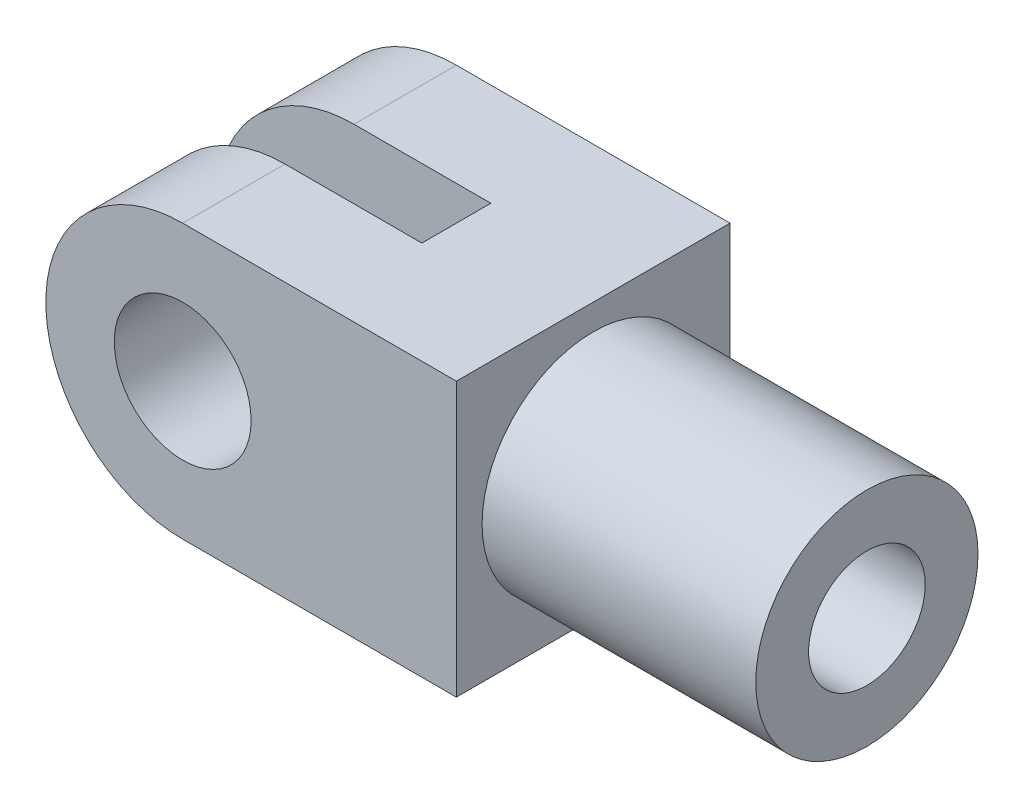
ISO-10303-21;
HEADER;
FILE_DESCRIPTION(('STEP AP214'),'2;1');
FILE_NAME('part.step','',(''),(''),'','','');
FILE_SCHEMA(('AUTOMOTIVE_DESIGN { 1 0 10303 214 1 1 1 1 }'));
ENDSEC;
DATA;
#1=APPLICATION_CONTEXT('core data for automotive mechanical design processes');
#2=APPLICATION_PROTOCOL_DEFINITION('international standard','automotive_design',2000,#1);
#3=PRODUCT_CONTEXT('',#1,'mechanical');
#4=PRODUCT('Part','Part','',(#3));
#5=PRODUCT_RELATED_PRODUCT_CATEGORY('part','',(#4));
#6=PRODUCT_DEFINITION_FORMATION('','',#4);
#7=PRODUCT_DEFINITION_CONTEXT('part definition',#1,'design');
#8=PRODUCT_DEFINITION('design','',#6,#7);
#9=PRODUCT_DEFINITION_SHAPE('','',#8);
#10=(LENGTH_UNIT() NAMED_UNIT(*) SI_UNIT(.MILLI.,.METRE.));
#11=(NAMED_UNIT(*) PLANE_ANGLE_UNIT() SI_UNIT($,.RADIAN.));
#12=(NAMED_UNIT(*) SI_UNIT($,.STERADIAN.) SOLID_ANGLE_UNIT());
#13=UNCERTAINTY_MEASURE_WITH_UNIT(LENGTH_MEASURE(1.E-05),#10,'distance_accuracy_value','');
#14=(GEOMETRIC_REPRESENTATION_CONTEXT(3) GLOBAL_UNCERTAINTY_ASSIGNED_CONTEXT((#13)) GLOBAL_UNIT_ASSIGNED_CONTEXT((#10,
#11,#12)) REPRESENTATION_CONTEXT('',''));
#15=CARTESIAN_POINT('',(0.,0.,0.));
#16=DIRECTION('',(0.,0.,1.));
#17=DIRECTION('',(1.,0.,0.));
#18=AXIS2_PLACEMENT_3D('',#15,#16,#17);
#19=CARTESIAN_POINT('',(-6.35,3.175,6.35));
#20=DIRECTION('',(0.,0.,-1.));
#21=DIRECTION('',(-1.,0.,0.));
#22=AXIS2_PLACEMENT_3D('',#19,#20,#21);
#23=CYLINDRICAL_SURFACE('',#22,3.175);
#24=DIRECTION('',(0.,0.,-1.));
#25=VECTOR('',#24,1.);
#26=CARTESIAN_POINT('',(-6.35,0.,6.35));
#27=LINE('',#26,#25);
#28=CARTESIAN_POINT('',(-6.35,0.,2.3749));
#29=VERTEX_POINT('',#28);
#30=CARTESIAN_POINT('',(-6.35,0.,0.));
#31=VERTEX_POINT('',#30);
#32=EDGE_CURVE('E140',#29,#31,#27,.T.);
#33=ORIENTED_EDGE('',*,*,#32,.F.);
#34=CARTESIAN_POINT('',(-6.35,3.175,2.3749));
#35=DIRECTION('',(0.,0.,-1.));
#36=DIRECTION('',(-1.,0.,0.));
#37=AXIS2_PLACEMENT_3D('',#34,#35,#36);
#38=CIRCLE('',#37,3.175);
#39=CARTESIAN_POINT('',(-6.35,6.35,2.3749));
#40=VERTEX_POINT('',#39);
#41=EDGE_CURVE('E133',#40,#29,#38,.F.);
#42=ORIENTED_EDGE('',*,*,#41,.F.);
#43=DIRECTION('',(0.,0.,-1.));
#44=VECTOR('',#43,1.);
#45=CARTESIAN_POINT('',(-6.35,6.35,6.35));
#46=LINE('',#45,#44);
#47=CARTESIAN_POINT('',(-6.35,6.35,0.));
#48=VERTEX_POINT('',#47);
#49=EDGE_CURVE('E139',#40,#48,#46,.T.);
#50=ORIENTED_EDGE('',*,*,#49,.T.);
#51=CARTESIAN_POINT('',(-6.35,3.175,0.));
#52=DIRECTION('',(0.,0.,1.));
#53=DIRECTION('',(1.,0.,0.));
#54=AXIS2_PLACEMENT_3D('',#51,#52,#53);
#55=CIRCLE('',#54,3.175);
#56=EDGE_CURVE('E165',#48,#31,#55,.T.);
#57=ORIENTED_EDGE('',*,*,#56,.T.);
#58=EDGE_LOOP('',(#33,#42,#50,#57));
#59=FACE_BOUND('',#58,.T.);
#60=ADVANCED_FACE('F37',(#59),#23,.T.);
#61=CARTESIAN_POINT('',(-3.175,3.175,3.175));
#62=DIRECTION('',(1.,0.,0.));
#63=DIRECTION('',(0.,0.,-1.));
#64=AXIS2_PLACEMENT_3D('',#61,#62,#63);
#65=CONICAL_SURFACE('',#64,1.35255,1.02974425867665);
#66=CARTESIAN_POINT('',(-3.175,3.175,3.175));
#67=DIRECTION('',(1.,0.,0.));
#68=DIRECTION('',(0.,0.,-1.));
#69=AXIS2_PLACEMENT_3D('',#66,#67,#68);
#70=CIRCLE('',#69,1.35255);
#71=CARTESIAN_POINT('',(-3.175,2.08448109026025,2.3749));
#72=VERTEX_POINT('',#71);
#73=CARTESIAN_POINT('',(-3.175,4.26551890973975,2.3749));
#74=VERTEX_POINT('',#73);
#75=EDGE_CURVE('E286',#72,#74,#70,.T.);
#76=ORIENTED_EDGE('',*,*,#75,.T.);
#77=CARTESIAN_POINT('',(0.27754955633769,-3.87832240767192,2.3749));
#78=CARTESIAN_POINT('',(0.14093407928206,-3.64948900061897,2.3749));
#79=CARTESIAN_POINT('',(0.00437338760329777,-3.42062283853676,2.3749));
#80=CARTESIAN_POINT('',(-0.268592753212355,-2.96276260658223,2.3749));
#81=CARTESIAN_POINT('',(-0.404998182880497,-2.73376852510425,2.3749));
#82=CARTESIAN_POINT('',(-0.677923696833488,-2.27505943543138,2.3749));
#83=CARTESIAN_POINT('',(-0.814443189908922,-2.04534407529801,2.3749));
#84=CARTESIAN_POINT('',(-1.08712177020637,-1.5857342243111,2.3749));
#85=CARTESIAN_POINT('',(-1.2232808959571,-1.35583975631494,2.3749));
#86=CARTESIAN_POINT('',(-1.51596855360878,-0.860381820988875,2.3749));
#87=CARTESIAN_POINT('',(-1.67241101917233,-0.594767412673329,2.3749));
#88=CARTESIAN_POINT('',(-1.90614933521455,-0.195738315680284,2.3749));
#89=CARTESIAN_POINT('',(-1.98392194909108,-0.0626030800459058,2.3749));
#90=CARTESIAN_POINT('',(-2.139004967626,0.203930439249866,2.3749));
#91=CARTESIAN_POINT('',(-2.21631538786408,0.33732871384082,2.3749));
#92=CARTESIAN_POINT('',(-2.37012764996504,0.604282360582873,2.3749));
#93=CARTESIAN_POINT('',(-2.44663066515824,0.737837054967363,2.3749));
#94=CARTESIAN_POINT('',(-2.59859027335269,1.0055640336136,2.3749));
#95=CARTESIAN_POINT('',(-2.67404672690936,1.13973639706134,2.3749));
#96=CARTESIAN_POINT('',(-2.82316619022494,1.4089693987552,2.3749));
#97=CARTESIAN_POINT('',(-2.8968303423305,1.54402939760945,2.3749));
#98=CARTESIAN_POINT('',(-3.00483186488762,1.74792542945005,2.3749));
#99=CARTESIAN_POINT('',(-3.04041292369469,1.81610109969729,2.3749));
#100=CARTESIAN_POINT('',(-3.11036405378111,1.95306941136842,2.3749));
#101=CARTESIAN_POINT('',(-3.14473421942882,2.02186200418725,2.3749));
#102=CARTESIAN_POINT('',(-3.19203032482178,2.11970462597219,2.3749));
#103=CARTESIAN_POINT('',(-3.205706616144,2.14839164504552,2.3749));
#104=CARTESIAN_POINT('',(-3.2326846463818,2.20594199083874,2.3749));
#105=CARTESIAN_POINT('',(-3.24598637430465,2.23480532270289,2.3749));
#106=CARTESIAN_POINT('',(-3.28523000451059,2.3217143278387,2.3749));
#107=CARTESIAN_POINT('',(-3.31050413404044,2.38006629679363,2.3749));
#108=CARTESIAN_POINT('',(-3.35824221569507,2.49741237022606,2.3749));
#109=CARTESIAN_POINT('',(-3.38072578603927,2.55639839911808,2.3749));
#110=CARTESIAN_POINT('',(-3.42178830517444,2.67573521556885,2.3749));
#111=CARTESIAN_POINT('',(-3.44036890164053,2.73608541526466,2.3749));
#112=CARTESIAN_POINT('',(-3.46678524403877,2.8390707655094,2.3749));
#113=CARTESIAN_POINT('',(-3.47616226086067,2.88130433685098,2.3749));
#114=CARTESIAN_POINT('',(-3.49147130455286,2.96639105287135,2.3749));
#115=CARTESIAN_POINT('',(-3.49740483312523,3.00924391910715,2.3749));
#116=CARTESIAN_POINT('',(-3.50521988360048,3.09507454091209,2.3749));
#117=CARTESIAN_POINT('',(-3.50712516675194,3.13805005826328,2.3749));
#118=CARTESIAN_POINT('',(-3.50673854009485,3.2239845678327,2.3749));
#119=CARTESIAN_POINT('',(-3.50444614272695,3.26694355755158,2.3749));
#120=CARTESIAN_POINT('',(-3.49467533131808,3.36487181353254,2.3749));
#121=CARTESIAN_POINT('',(-3.48588496993609,3.41970855253983,2.3749));
#122=CARTESIAN_POINT('',(-3.46306411978303,3.52827561065544,2.3749));
#123=CARTESIAN_POINT('',(-3.44902891654589,3.58200488830585,2.3749));
#124=CARTESIAN_POINT('',(-3.41681007229671,3.68956548187648,2.3749));
#125=CARTESIAN_POINT('',(-3.39853602485278,3.74336905663119,2.3749));
#126=CARTESIAN_POINT('',(-3.36907010352603,3.82328944393087,2.3749));
#127=CARTESIAN_POINT('',(-3.35890678486155,3.84979610654341,2.3749));
#128=CARTESIAN_POINT('',(-3.33800301682598,3.90258020494899,2.3749));
#129=CARTESIAN_POINT('',(-3.32726259128858,3.92885765015636,2.3749));
#130=CARTESIAN_POINT('',(-3.29024043807533,4.01713174112982,2.3749));
#131=CARTESIAN_POINT('',(-3.262855862259,4.07866510681277,2.3749));
#132=CARTESIAN_POINT('',(-3.20631052713625,4.20091385190507,2.3749));
#133=CARTESIAN_POINT('',(-3.17714938893251,4.26162905342433,2.3749));
#134=CARTESIAN_POINT('',(-3.11758658239418,4.38249111240487,2.3749));
#135=CARTESIAN_POINT('',(-3.08718417718028,4.44263760537461,2.3749));
#136=CARTESIAN_POINT('',(-3.02550664815928,4.56248244129595,2.3749));
#137=CARTESIAN_POINT('',(-2.99423148904062,4.62218076599033,2.3749));
#138=CARTESIAN_POINT('',(-2.89932223710185,4.80104280037361,2.3749));
#139=CARTESIAN_POINT('',(-2.83474079199201,4.9197028141689,2.3749));
#140=CARTESIAN_POINT('',(-2.70416974006977,5.15618221115941,2.3749));
#141=CARTESIAN_POINT('',(-2.63818065890539,5.27400188696373,2.3749));
#142=CARTESIAN_POINT('',(-2.51508189505257,5.49180823612097,2.3749));
#143=CARTESIAN_POINT('',(-2.45809623045446,5.59186507258519,2.3749));
#144=CARTESIAN_POINT('',(-2.34365280932106,5.79172279677255,2.3749));
#145=CARTESIAN_POINT('',(-2.28619500093451,5.89152365476103,2.3749));
#146=CARTESIAN_POINT('',(-2.17118018765201,6.09051658157884,2.3749));
#147=CARTESIAN_POINT('',(-2.11362458096428,6.1897094592134,2.3749));
#148=CARTESIAN_POINT('',(-1.99826341927211,6.38793361583524,2.3749));
#149=CARTESIAN_POINT('',(-1.9404578956028,6.48696491305324,2.3749));
#150=CARTESIAN_POINT('',(-1.88256303088183,6.58594367214491,2.3749));
#151=B_SPLINE_CURVE_WITH_KNOTS('',3,(#77,#78,#79,#80,#81,#82,#83,#84,#85,#86,#87,#88,#89,#90,
#91,#92,#93,#94,#95,#96,#97,#98,#99,#100,#101,#102,#103,#104,#105,#106,#107,#108,#109,#110,#111,
#112,#113,#114,#115,#116,#117,#118,#119,#120,#121,#122,#123,#124,#125,#126,#127,#128,#129,#130,
#131,#132,#133,#134,#135,#136,#137,#138,#139,#140,#141,#142,#143,#144,#145,#146,#147,#148,#149,
#150),.UNSPECIFIED.,.F.,.F.,(4,2,2,2,2,2,2,2,2,2,2,2,2,2,2,2,2,2,2,2,2,2,2,2,2,2,2,2,2,2,2,2,2,
2,2,2,4),(0.,0.799535320590594,1.59916177257743,2.40082258956373,3.20239392246196,
4.12717658334506,4.5897363389746,5.05228041363856,5.51401925950781,5.97581904791662,
6.4373163537411,6.6680157674566,6.89869716215773,6.99403553230975,7.08937669755373,
7.28010147461924,7.46939867435001,7.65861579926221,7.78828949366436,7.91790659490906,
8.04675697106372,8.175622314101,8.3418851127035,8.50829772195863,8.67865296710429,
8.76381339030635,8.84897029920377,9.05097601483089,9.25302496519424,9.45519565769012,
9.65737454189046,10.0626416358487,10.4677599538318,10.8131978516219,11.1586742066847,
11.5027186495149,11.8467211387723),.UNSPECIFIED.);
#152=EDGE_CURVE('E262',#72,#74,#151,.T.);
#153=ORIENTED_EDGE('',*,*,#152,.F.);
#154=EDGE_LOOP('',(#76,#153));
#155=FACE_BOUND('',#154,.T.);
#156=ADVANCED_FACE('F196',(#155),#65,.F.);
#157=CARTESIAN_POINT('',(0.,0.,6.35));
#158=DIRECTION('',(-1.,0.,0.));
#159=DIRECTION('',(0.,0.,1.));
#160=AXIS2_PLACEMENT_3D('',#157,#158,#159);
#161=PLANE('',#160);
#162=CARTESIAN_POINT('',(0.,3.175,3.175));
#163=DIRECTION('',(1.,0.,0.));
#164=DIRECTION('',(0.,0.,-1.));
#165=AXIS2_PLACEMENT_3D('',#162,#163,#164);
#166=CIRCLE('',#165,2.5781);
#167=CARTESIAN_POINT('',(0.,3.175,0.596899999999999));
#168=VERTEX_POINT('',#167);
#169=EDGE_CURVE('E11',#168,#168,#166,.T.);
#170=ORIENTED_EDGE('',*,*,#169,.F.);
#171=EDGE_LOOP('',(#170));
#172=FACE_BOUND('',#171,.T.);
#173=DIRECTION('',(0.,1.,0.));
#174=VECTOR('',#173,1.);
#175=CARTESIAN_POINT('',(0.,0.,0.));
#176=LINE('',#175,#174);
#177=CARTESIAN_POINT('',(0.,0.,0.));
#178=VERTEX_POINT('',#177);
#179=CARTESIAN_POINT('',(0.,6.35,0.));
#180=VERTEX_POINT('',#179);
#181=EDGE_CURVE('E160',#178,#180,#176,.T.);
#182=ORIENTED_EDGE('',*,*,#181,.T.);
#183=DIRECTION('',(0.,0.,-1.));
#184=VECTOR('',#183,1.);
#185=CARTESIAN_POINT('',(0.,6.35,6.35));
#186=LINE('',#185,#184);
#187=CARTESIAN_POINT('',(0.,6.35,6.35));
#188=VERTEX_POINT('',#187);
#189=EDGE_CURVE('E41',#188,#180,#186,.T.);
#190=ORIENTED_EDGE('',*,*,#189,.F.);
#191=DIRECTION('',(0.,1.,0.));
#192=VECTOR('',#191,1.);
#193=CARTESIAN_POINT('',(0.,0.,6.35));
#194=LINE('',#193,#192);
#195=CARTESIAN_POINT('',(0.,0.,6.35));
#196=VERTEX_POINT('',#195);
#197=EDGE_CURVE('E175',#196,#188,#194,.T.);
#198=ORIENTED_EDGE('',*,*,#197,.F.);
#199=DIRECTION('',(0.,0.,-1.));
#200=VECTOR('',#199,1.);
#201=CARTESIAN_POINT('',(0.,0.,6.35));
#202=LINE('',#201,#200);
#203=EDGE_CURVE('E142',#196,#178,#202,.T.);
#204=ORIENTED_EDGE('',*,*,#203,.T.);
#205=EDGE_LOOP('',(#182,#190,#198,#204));
#206=FACE_BOUND('',#205,.T.);
#207=ADVANCED_FACE('F39',(#172,#206),#161,.F.);
#208=CARTESIAN_POINT('',(0.,6.35,6.35));
#209=DIRECTION('',(0.,-1.,0.));
#210=DIRECTION('',(1.,0.,0.));
#211=AXIS2_PLACEMENT_3D('',#208,#209,#210);
#212=PLANE('',#211);
#213=ORIENTED_EDGE('',*,*,#49,.F.);
#214=DIRECTION('',(-1.,0.,0.));
#215=VECTOR('',#214,1.);
#216=CARTESIAN_POINT('',(-3.175,6.35,2.3749));
#217=LINE('',#216,#215);
#218=CARTESIAN_POINT('',(-3.175,6.35,2.3749));
#219=VERTEX_POINT('',#218);
#220=EDGE_CURVE('E272',#219,#40,#217,.T.);
#221=ORIENTED_EDGE('',*,*,#220,.F.);
#222=DIRECTION('',(0.,0.,-1.));
#223=VECTOR('',#222,1.);
#224=CARTESIAN_POINT('',(-3.175,6.35,3.9751));
#225=LINE('',#224,#223);
#226=CARTESIAN_POINT('',(-3.175,6.35,3.9751));
#227=VERTEX_POINT('',#226);
#228=EDGE_CURVE('E269',#227,#219,#225,.T.);
#229=ORIENTED_EDGE('',*,*,#228,.F.);
#230=DIRECTION('',(1.,0.,0.));
#231=VECTOR('',#230,1.);
#232=CARTESIAN_POINT('',(-3.175,6.35,3.9751));
#233=LINE('',#232,#231);
#234=CARTESIAN_POINT('',(-6.35,6.35,3.9751));
#235=VERTEX_POINT('',#234);
#236=EDGE_CURVE('E253',#235,#227,#233,.T.);
#237=ORIENTED_EDGE('',*,*,#236,.F.);
#238=CARTESIAN_POINT('',(-6.35,6.35,6.35));
#239=VERTEX_POINT('',#238);
#240=EDGE_CURVE('E132',#239,#235,#46,.T.);
#241=ORIENTED_EDGE('',*,*,#240,.F.);
#242=DIRECTION('',(-1.,0.,0.));
#243=VECTOR('',#242,1.);
#244=CARTESIAN_POINT('',(0.,6.35,6.35));
#245=LINE('',#244,#243);
#246=EDGE_CURVE('E154',#188,#239,#245,.T.);
#247=ORIENTED_EDGE('',*,*,#246,.F.);
#248=ORIENTED_EDGE('',*,*,#189,.T.);
#249=DIRECTION('',(-1.,0.,0.));
#250=VECTOR('',#249,1.);
#251=CARTESIAN_POINT('',(0.,6.35,0.));
#252=LINE('',#251,#250);
#253=EDGE_CURVE('E152',#180,#48,#252,.T.);
#254=ORIENTED_EDGE('',*,*,#253,.T.);
#255=EDGE_LOOP('',(#213,#221,#229,#237,#241,#247,#248,#254));
#256=FACE_BOUND('',#255,.T.);
#257=ADVANCED_FACE('F151',(#256),#212,.F.);
#258=ORIENTED_EDGE('',*,*,#240,.T.);
#259=CARTESIAN_POINT('',(-6.35,3.175,3.9751));
#260=DIRECTION('',(0.,0.,1.));
#261=DIRECTION('',(1.,0.,0.));
#262=AXIS2_PLACEMENT_3D('',#259,#260,#261);
#263=CIRCLE('',#262,3.175);
#264=CARTESIAN_POINT('',(-6.35,0.,3.9751));
#265=VERTEX_POINT('',#264);
#266=EDGE_CURVE('E117',#265,#235,#263,.F.);
#267=ORIENTED_EDGE('',*,*,#266,.F.);
#268=CARTESIAN_POINT('',(-6.35,0.,6.35));
#269=VERTEX_POINT('',#268);
#270=EDGE_CURVE('E129',#269,#265,#27,.T.);
#271=ORIENTED_EDGE('',*,*,#270,.F.);
#272=CARTESIAN_POINT('',(-6.35,3.175,6.35));
#273=DIRECTION('',(0.,0.,1.));
#274=DIRECTION('',(1.,0.,0.));
#275=AXIS2_PLACEMENT_3D('',#272,#273,#274);
#276=CIRCLE('',#275,3.175);
#277=EDGE_CURVE('E178',#239,#269,#276,.T.);
#278=ORIENTED_EDGE('',*,*,#277,.F.);
#279=EDGE_LOOP('',(#258,#267,#271,#278));
#280=FACE_BOUND('',#279,.T.);
#281=ADVANCED_FACE('F127',(#280),#23,.T.);
#282=CARTESIAN_POINT('',(0.,0.,6.35));
#283=DIRECTION('',(0.,1.,0.));
#284=DIRECTION('',(-1.,0.,0.));
#285=AXIS2_PLACEMENT_3D('',#282,#283,#284);
#286=PLANE('',#285);
#287=DIRECTION('',(0.,0.,1.));
#288=VECTOR('',#287,1.);
#289=CARTESIAN_POINT('',(-3.175,0.,3.9751));
#290=LINE('',#289,#288);
#291=CARTESIAN_POINT('',(-3.175,0.,2.3749));
#292=VERTEX_POINT('',#291);
#293=CARTESIAN_POINT('',(-3.175,0.,3.9751));
#294=VERTEX_POINT('',#293);
#295=EDGE_CURVE('E53',#292,#294,#290,.T.);
#296=ORIENTED_EDGE('',*,*,#295,.F.);
#297=DIRECTION('',(1.,0.,0.));
#298=VECTOR('',#297,1.);
#299=CARTESIAN_POINT('',(-3.175,0.,2.3749));
#300=LINE('',#299,#298);
#301=EDGE_CURVE('E122',#29,#292,#300,.T.);
#302=ORIENTED_EDGE('',*,*,#301,.F.);
#303=ORIENTED_EDGE('',*,*,#32,.T.);
#304=DIRECTION('',(1.,0.,0.));
#305=VECTOR('',#304,1.);
#306=CARTESIAN_POINT('',(0.,0.,0.));
#307=LINE('',#306,#305);
#308=EDGE_CURVE('E174',#31,#178,#307,.T.);
#309=ORIENTED_EDGE('',*,*,#308,.T.);
#310=ORIENTED_EDGE('',*,*,#203,.F.);
#311=DIRECTION('',(1.,0.,0.));
#312=VECTOR('',#311,1.);
#313=CARTESIAN_POINT('',(0.,0.,6.35));
#314=LINE('',#313,#312);
#315=EDGE_CURVE('E138',#269,#196,#314,.T.);
#316=ORIENTED_EDGE('',*,*,#315,.F.);
#317=ORIENTED_EDGE('',*,*,#270,.T.);
#318=DIRECTION('',(-1.,0.,0.));
#319=VECTOR('',#318,1.);
#320=CARTESIAN_POINT('',(-3.175,0.,3.9751));
#321=LINE('',#320,#319);
#322=EDGE_CURVE('E113',#294,#265,#321,.T.);
#323=ORIENTED_EDGE('',*,*,#322,.F.);
#324=EDGE_LOOP('',(#296,#302,#303,#309,#310,#316,#317,#323));
#325=FACE_BOUND('',#324,.T.);
#326=ADVANCED_FACE('F136',(#325),#286,.F.);
#327=CARTESIAN_POINT('',(-6.35,3.175,6.35));
#328=DIRECTION('',(0.,0.,1.));
#329=DIRECTION('',(1.,0.,0.));
#330=AXIS2_PLACEMENT_3D('',#327,#328,#329);
#331=PLANE('',#330);
#332=CARTESIAN_POINT('',(-6.35,3.175,6.35));
#333=DIRECTION('',(0.,0.,1.));
#334=DIRECTION('',(1.,0.,0.));
#335=AXIS2_PLACEMENT_3D('',#332,#333,#334);
#336=CIRCLE('',#335,1.5875);
#337=CARTESIAN_POINT('',(-4.7625,3.175,6.35));
#338=VERTEX_POINT('',#337);
#339=EDGE_CURVE('E298',#338,#338,#336,.T.);
#340=ORIENTED_EDGE('',*,*,#339,.F.);
#341=EDGE_LOOP('',(#340));
#342=FACE_BOUND('',#341,.T.);
#343=ORIENTED_EDGE('',*,*,#197,.T.);
#344=ORIENTED_EDGE('',*,*,#246,.T.);
#345=ORIENTED_EDGE('',*,*,#277,.T.);
#346=ORIENTED_EDGE('',*,*,#315,.T.);
#347=EDGE_LOOP('',(#343,#344,#345,#346));
#348=FACE_BOUND('',#347,.T.);
#349=ADVANCED_FACE('F180',(#342,#348),#331,.T.);
#350=CARTESIAN_POINT('',(-6.35,3.175,0.));
#351=DIRECTION('',(0.,0.,1.));
#352=DIRECTION('',(1.,0.,0.));
#353=AXIS2_PLACEMENT_3D('',#350,#351,#352);
#354=PLANE('',#353);
#355=CARTESIAN_POINT('',(-6.35,3.175,0.));
#356=DIRECTION('',(0.,0.,-1.));
#357=DIRECTION('',(-1.,0.,0.));
#358=AXIS2_PLACEMENT_3D('',#355,#356,#357);
#359=CIRCLE('',#358,1.1303);
#360=CARTESIAN_POINT('',(-7.4803,3.175,0.));
#361=VERTEX_POINT('',#360);
#362=EDGE_CURVE('E309',#361,#361,#359,.T.);
#363=ORIENTED_EDGE('',*,*,#362,.F.);
#364=EDGE_LOOP('',(#363));
#365=FACE_BOUND('',#364,.T.);
#366=ORIENTED_EDGE('',*,*,#181,.F.);
#367=ORIENTED_EDGE('',*,*,#308,.F.);
#368=ORIENTED_EDGE('',*,*,#56,.F.);
#369=ORIENTED_EDGE('',*,*,#253,.F.);
#370=EDGE_LOOP('',(#366,#367,#368,#369));
#371=FACE_BOUND('',#370,.T.);
#372=ADVANCED_FACE('F182',(#365,#371),#354,.F.);
#373=CARTESIAN_POINT('',(6.35,3.175,3.175));
#374=DIRECTION('',(-1.,0.,0.));
#375=DIRECTION('',(0.,0.,1.));
#376=AXIS2_PLACEMENT_3D('',#373,#374,#375);
#377=CYLINDRICAL_SURFACE('',#376,2.5781);
#378=CARTESIAN_POINT('',(6.35,3.175,3.175));
#379=DIRECTION('',(1.,0.,0.));
#380=DIRECTION('',(0.,0.,-1.));
#381=AXIS2_PLACEMENT_3D('',#378,#379,#380);
#382=CIRCLE('',#381,2.5781);
#383=CARTESIAN_POINT('',(6.35,3.175,0.596899999999999));
#384=VERTEX_POINT('',#383);
#385=EDGE_CURVE('E163',#384,#384,#382,.T.);
#386=ORIENTED_EDGE('',*,*,#385,.F.);
#387=EDGE_LOOP('',(#386));
#388=FACE_BOUND('',#387,.T.);
#389=ORIENTED_EDGE('',*,*,#169,.T.);
#390=EDGE_LOOP('',(#389));
#391=FACE_BOUND('',#390,.T.);
#392=ADVANCED_FACE('F189',(#388,#391),#377,.T.);
#393=CARTESIAN_POINT('',(6.35,3.175,3.175));
#394=DIRECTION('',(1.,0.,0.));
#395=DIRECTION('',(0.,0.,-1.));
#396=AXIS2_PLACEMENT_3D('',#393,#394,#395);
#397=PLANE('',#396);
#398=CARTESIAN_POINT('',(6.35,3.175,3.175));
#399=DIRECTION('',(1.,0.,0.));
#400=DIRECTION('',(0.,0.,-1.));
#401=AXIS2_PLACEMENT_3D('',#398,#399,#400);
#402=CIRCLE('',#401,1.35254999999999);
#403=CARTESIAN_POINT('',(6.35,3.175,1.82245000000001));
#404=VERTEX_POINT('',#403);
#405=EDGE_CURVE('E291',#404,#404,#402,.T.);
#406=ORIENTED_EDGE('',*,*,#405,.F.);
#407=EDGE_LOOP('',(#406));
#408=FACE_BOUND('',#407,.T.);
#409=ORIENTED_EDGE('',*,*,#385,.T.);
#410=EDGE_LOOP('',(#409));
#411=FACE_BOUND('',#410,.T.);
#412=ADVANCED_FACE('F219',(#408,#411),#397,.T.);
#413=CARTESIAN_POINT('',(-3.175,4.26551890973975,3.9751));
#414=VERTEX_POINT('',#413);
#415=CARTESIAN_POINT('',(-3.175,2.08448109026024,3.9751));
#416=VERTEX_POINT('',#415);
#417=EDGE_CURVE('E284',#414,#416,#70,.T.);
#418=ORIENTED_EDGE('',*,*,#417,.T.);
#419=CARTESIAN_POINT('',(0.27754955633769,-3.87832240767192,3.9751));
#420=CARTESIAN_POINT('',(0.14093407928206,-3.64948900061897,3.9751));
#421=CARTESIAN_POINT('',(0.00437338760329726,-3.42062283853676,3.9751));
#422=CARTESIAN_POINT('',(-0.268592753212356,-2.96276260658222,3.9751));
#423=CARTESIAN_POINT('',(-0.404998182880498,-2.73376852510425,3.9751));
#424=CARTESIAN_POINT('',(-0.67792369683349,-2.27505943543137,3.9751));
#425=CARTESIAN_POINT('',(-0.814443189908924,-2.045344075298,3.9751));
#426=CARTESIAN_POINT('',(-1.08712177020637,-1.5857342243111,3.9751));
#427=CARTESIAN_POINT('',(-1.22328089595711,-1.35583975631494,3.9751));
#428=CARTESIAN_POINT('',(-1.51596855360878,-0.86038182098887,3.9751));
#429=CARTESIAN_POINT('',(-1.67241101917233,-0.594767412673325,3.9751));
#430=CARTESIAN_POINT('',(-1.90614933521455,-0.19573831568028,3.9751));
#431=CARTESIAN_POINT('',(-1.98392194909109,-0.0626030800459023,3.9751));
#432=CARTESIAN_POINT('',(-2.139004967626,0.203930439249869,3.9751));
#433=CARTESIAN_POINT('',(-2.21631538786408,0.337328713840823,3.9751));
#434=CARTESIAN_POINT('',(-2.37012764996504,0.604282360582875,3.9751));
#435=CARTESIAN_POINT('',(-2.44663066515824,0.737837054967365,3.9751));
#436=CARTESIAN_POINT('',(-2.59859027335269,1.0055640336136,3.9751));
#437=CARTESIAN_POINT('',(-2.67404672690936,1.13973639706134,3.9751));
#438=CARTESIAN_POINT('',(-2.82316619022494,1.4089693987552,3.9751));
#439=CARTESIAN_POINT('',(-2.8968303423305,1.54402939760945,3.9751));
#440=CARTESIAN_POINT('',(-3.00483186488762,1.74792542945005,3.9751));
#441=CARTESIAN_POINT('',(-3.04041292369469,1.81610109969729,3.9751));
#442=CARTESIAN_POINT('',(-3.11036405378111,1.95306941136843,3.9751));
#443=CARTESIAN_POINT('',(-3.14473421942882,2.02186200418725,3.9751));
#444=CARTESIAN_POINT('',(-3.19203032482178,2.11970462597219,3.9751));
#445=CARTESIAN_POINT('',(-3.205706616144,2.14839164504552,3.9751));
#446=CARTESIAN_POINT('',(-3.2326846463818,2.20594199083874,3.9751));
#447=CARTESIAN_POINT('',(-3.24598637430465,2.23480532270289,3.9751));
#448=CARTESIAN_POINT('',(-3.28523000451059,2.3217143278387,3.9751));
#449=CARTESIAN_POINT('',(-3.31050413404044,2.38006629679363,3.9751));
#450=CARTESIAN_POINT('',(-3.35824221569507,2.49741237022606,3.9751));
#451=CARTESIAN_POINT('',(-3.38072578603927,2.55639839911808,3.9751));
#452=CARTESIAN_POINT('',(-3.42178830517444,2.67573521556885,3.9751));
#453=CARTESIAN_POINT('',(-3.44036890164053,2.73608541526466,3.9751));
#454=CARTESIAN_POINT('',(-3.46678524403877,2.8390707655094,3.9751));
#455=CARTESIAN_POINT('',(-3.47616226086067,2.88130433685098,3.9751));
#456=CARTESIAN_POINT('',(-3.49147130455286,2.96639105287135,3.9751));
#457=CARTESIAN_POINT('',(-3.49740483312523,3.00924391910715,3.9751));
#458=CARTESIAN_POINT('',(-3.50521988360048,3.0950745409121,3.9751));
#459=CARTESIAN_POINT('',(-3.50712516675194,3.13805005826328,3.9751));
#460=CARTESIAN_POINT('',(-3.50673854009485,3.2239845678327,3.9751));
#461=CARTESIAN_POINT('',(-3.50444614272694,3.26694355755158,3.9751));
#462=CARTESIAN_POINT('',(-3.49467533131808,3.36487181353254,3.9751));
#463=CARTESIAN_POINT('',(-3.48588496993609,3.41970855253983,3.9751));
#464=CARTESIAN_POINT('',(-3.46306411978303,3.52827561065544,3.9751));
#465=CARTESIAN_POINT('',(-3.44902891654589,3.58200488830585,3.9751));
#466=CARTESIAN_POINT('',(-3.41681007229671,3.68956548187649,3.9751));
#467=CARTESIAN_POINT('',(-3.39853602485278,3.7433690566312,3.9751));
#468=CARTESIAN_POINT('',(-3.36907010352603,3.82328944393088,3.9751));
#469=CARTESIAN_POINT('',(-3.35890678486155,3.84979610654342,3.9751));
#470=CARTESIAN_POINT('',(-3.33800301682598,3.90258020494899,3.9751));
#471=CARTESIAN_POINT('',(-3.32726259128858,3.92885765015636,3.9751));
#472=CARTESIAN_POINT('',(-3.29024043807533,4.01713174112982,3.9751));
#473=CARTESIAN_POINT('',(-3.262855862259,4.07866510681277,3.9751));
#474=CARTESIAN_POINT('',(-3.20631052713625,4.20091385190507,3.9751));
#475=CARTESIAN_POINT('',(-3.17714938893251,4.26162905342433,3.9751));
#476=CARTESIAN_POINT('',(-3.11758658239418,4.38249111240488,3.9751));
#477=CARTESIAN_POINT('',(-3.08718417718028,4.44263760537461,3.9751));
#478=CARTESIAN_POINT('',(-3.02550664815928,4.56248244129595,3.9751));
#479=CARTESIAN_POINT('',(-2.99423148904062,4.62218076599033,3.9751));
#480=CARTESIAN_POINT('',(-2.89932223710184,4.80104280037361,3.9751));
#481=CARTESIAN_POINT('',(-2.83474079199201,4.9197028141689,3.9751));
#482=CARTESIAN_POINT('',(-2.70416974006977,5.15618221115942,3.9751));
#483=CARTESIAN_POINT('',(-2.63818065890539,5.27400188696374,3.9751));
#484=CARTESIAN_POINT('',(-2.51508189505257,5.49180823612098,3.9751));
#485=CARTESIAN_POINT('',(-2.45809623045446,5.5918650725852,3.9751));
#486=CARTESIAN_POINT('',(-2.34365280932105,5.79172279677256,3.9751));
#487=CARTESIAN_POINT('',(-2.2861950009345,5.89152365476104,3.9751));
#488=CARTESIAN_POINT('',(-2.17118018765201,6.09051658157886,3.9751));
#489=CARTESIAN_POINT('',(-2.11362458096427,6.18970945921341,3.9751));
#490=CARTESIAN_POINT('',(-1.9982634192721,6.38793361583526,3.9751));
#491=CARTESIAN_POINT('',(-1.94045789560278,6.48696491305326,3.9751));
#492=CARTESIAN_POINT('',(-1.88256303088181,6.58594367214493,3.9751));
#493=B_SPLINE_CURVE_WITH_KNOTS('',3,(#419,#420,#421,#422,#423,#424,#425,#426,#427,#428,#429,
#430,#431,#432,#433,#434,#435,#436,#437,#438,#439,#440,#441,#442,#443,#444,#445,#446,#447,#448,
#449,#450,#451,#452,#453,#454,#455,#456,#457,#458,#459,#460,#461,#462,#463,#464,#465,#466,#467,
#468,#469,#470,#471,#472,#473,#474,#475,#476,#477,#478,#479,#480,#481,#482,#483,#484,#485,#486,
#487,#488,#489,#490,#491,#492),.UNSPECIFIED.,.F.,.F.,(4,2,2,2,2,2,2,2,2,2,2,2,2,2,2,2,2,2,2,2,2,
2,2,2,2,2,2,2,2,2,2,2,2,2,2,2,4),(0.,0.799535320590596,1.59916177257744,2.40082258956374,
3.20239392246197,4.12717658334507,4.5897363389746,5.05228041363856,5.51401925950781,
5.97581904791662,6.4373163537411,6.6680157674566,6.89869716215773,6.99403553230975,
7.08937669755373,7.28010147461924,7.46939867435001,7.65861579926221,7.78828949366435,
7.91790659490906,8.04675697106372,8.175622314101,8.3418851127035,8.50829772195863,
8.67865296710429,8.76381339030635,8.84897029920378,9.05097601483089,9.25302496519424,
9.45519565769013,9.65737454189046,10.0626416358487,10.4677599538318,10.8131978516219,
11.1586742066847,11.5027186495149,11.8467211387723),.UNSPECIFIED.);
#494=EDGE_CURVE('E60',#414,#416,#493,.F.);
#495=ORIENTED_EDGE('',*,*,#494,.F.);
#496=EDGE_LOOP('',(#418,#495));
#497=FACE_BOUND('',#496,.T.);
#498=ADVANCED_FACE('F204',(#497),#65,.F.);
#499=CARTESIAN_POINT('',(6.35,3.175,3.175));
#500=DIRECTION('',(1.,0.,0.));
#501=DIRECTION('',(0.,0.,-1.));
#502=AXIS2_PLACEMENT_3D('',#499,#500,#501);
#503=CYLINDRICAL_SURFACE('',#502,1.35254999999999);
#504=EDGE_CURVE('E168',#74,#414,#70,.T.);
#505=ORIENTED_EDGE('',*,*,#504,.F.);
#506=ORIENTED_EDGE('',*,*,#75,.F.);
#507=CARTESIAN_POINT('',(-3.175,3.175,3.175));
#508=DIRECTION('',(1.,0.,0.));
#509=DIRECTION('',(0.,0.,-1.));
#510=AXIS2_PLACEMENT_3D('',#507,#508,#509);
#511=CIRCLE('',#510,1.35255);
#512=EDGE_CURVE('E134',#416,#72,#511,.T.);
#513=ORIENTED_EDGE('',*,*,#512,.F.);
#514=ORIENTED_EDGE('',*,*,#417,.F.);
#515=EDGE_LOOP('',(#505,#506,#513,#514));
#516=FACE_BOUND('',#515,.T.);
#517=ORIENTED_EDGE('',*,*,#405,.T.);
#518=EDGE_LOOP('',(#517));
#519=FACE_BOUND('',#518,.T.);
#520=ADVANCED_FACE('F229',(#516,#519),#503,.F.);
#521=CARTESIAN_POINT('',(-3.175,6.351,3.9751));
#522=DIRECTION('',(1.,0.,0.));
#523=DIRECTION('',(0.,1.,0.));
#524=AXIS2_PLACEMENT_3D('',#521,#522,#523);
#525=PLANE('',#524);
#526=ORIENTED_EDGE('',*,*,#512,.T.);
#527=DIRECTION('',(0.,-1.,0.));
#528=VECTOR('',#527,1.);
#529=CARTESIAN_POINT('',(-3.175,6.351,2.3749));
#530=LINE('',#529,#528);
#531=EDGE_CURVE('E276',#72,#292,#530,.T.);
#532=ORIENTED_EDGE('',*,*,#531,.T.);
#533=ORIENTED_EDGE('',*,*,#295,.T.);
#534=DIRECTION('',(0.,-1.,0.));
#535=VECTOR('',#534,1.);
#536=CARTESIAN_POINT('',(-3.175,6.351,3.9751));
#537=LINE('',#536,#535);
#538=EDGE_CURVE('E119',#416,#294,#537,.T.);
#539=ORIENTED_EDGE('',*,*,#538,.F.);
#540=EDGE_LOOP('',(#526,#532,#533,#539));
#541=FACE_BOUND('',#540,.T.);
#542=ADVANCED_FACE('F233',(#541),#525,.F.);
#543=CARTESIAN_POINT('',(-3.175,6.351,2.3749));
#544=DIRECTION('',(0.,0.,-1.));
#545=DIRECTION('',(-1.,0.,0.));
#546=AXIS2_PLACEMENT_3D('',#543,#544,#545);
#547=PLANE('',#546);
#548=CARTESIAN_POINT('',(-6.35,3.175,2.3749));
#549=DIRECTION('',(0.,0.,-1.));
#550=DIRECTION('',(-1.,0.,0.));
#551=AXIS2_PLACEMENT_3D('',#548,#549,#550);
#552=CIRCLE('',#551,1.1303);
#553=CARTESIAN_POINT('',(-7.4803,3.175,2.3749));
#554=VERTEX_POINT('',#553);
#555=EDGE_CURVE('E306',#554,#554,#552,.T.);
#556=ORIENTED_EDGE('',*,*,#555,.T.);
#557=EDGE_LOOP('',(#556));
#558=FACE_BOUND('',#557,.T.);
#559=ORIENTED_EDGE('',*,*,#220,.T.);
#560=ORIENTED_EDGE('',*,*,#41,.T.);
#561=ORIENTED_EDGE('',*,*,#301,.T.);
#562=ORIENTED_EDGE('',*,*,#531,.F.);
#563=ORIENTED_EDGE('',*,*,#152,.T.);
#564=EDGE_CURVE('E254',#219,#74,#530,.T.);
#565=ORIENTED_EDGE('',*,*,#564,.F.);
#566=EDGE_LOOP('',(#559,#560,#561,#562,#563,#565));
#567=FACE_BOUND('',#566,.T.);
#568=ADVANCED_FACE('F243',(#558,#567),#547,.F.);
#569=CARTESIAN_POINT('',(-3.175,6.351,3.9751));
#570=DIRECTION('',(0.,0.,1.));
#571=DIRECTION('',(1.,0.,0.));
#572=AXIS2_PLACEMENT_3D('',#569,#570,#571);
#573=PLANE('',#572);
#574=CARTESIAN_POINT('',(-6.35,3.175,3.9751));
#575=DIRECTION('',(0.,0.,1.));
#576=DIRECTION('',(1.,0.,0.));
#577=AXIS2_PLACEMENT_3D('',#574,#575,#576);
#578=CIRCLE('',#577,1.5875);
#579=CARTESIAN_POINT('',(-4.7625,3.175,3.9751));
#580=VERTEX_POINT('',#579);
#581=EDGE_CURVE('E301',#580,#580,#578,.F.);
#582=ORIENTED_EDGE('',*,*,#581,.F.);
#583=EDGE_LOOP('',(#582));
#584=FACE_BOUND('',#583,.T.);
#585=ORIENTED_EDGE('',*,*,#236,.T.);
#586=EDGE_CURVE('E277',#227,#414,#537,.T.);
#587=ORIENTED_EDGE('',*,*,#586,.T.);
#588=ORIENTED_EDGE('',*,*,#494,.T.);
#589=ORIENTED_EDGE('',*,*,#538,.T.);
#590=ORIENTED_EDGE('',*,*,#322,.T.);
#591=ORIENTED_EDGE('',*,*,#266,.T.);
#592=EDGE_LOOP('',(#585,#587,#588,#589,#590,#591));
#593=FACE_BOUND('',#592,.T.);
#594=ADVANCED_FACE('F116',(#584,#593),#573,.F.);
#595=ORIENTED_EDGE('',*,*,#228,.T.);
#596=ORIENTED_EDGE('',*,*,#564,.T.);
#597=ORIENTED_EDGE('',*,*,#504,.T.);
#598=ORIENTED_EDGE('',*,*,#586,.F.);
#599=EDGE_LOOP('',(#595,#596,#597,#598));
#600=FACE_BOUND('',#599,.T.);
#601=ADVANCED_FACE('F235',(#600),#525,.F.);
#602=CARTESIAN_POINT('',(-6.35,3.175,-0.00100000000000013));
#603=DIRECTION('',(0.,0.,1.));
#604=DIRECTION('',(1.,0.,0.));
#605=AXIS2_PLACEMENT_3D('',#602,#603,#604);
#606=CYLINDRICAL_SURFACE('',#605,1.5875);
#607=ORIENTED_EDGE('',*,*,#339,.T.);
#608=EDGE_LOOP('',(#607));
#609=FACE_BOUND('',#608,.T.);
#610=ORIENTED_EDGE('',*,*,#581,.T.);
#611=EDGE_LOOP('',(#610));
#612=FACE_BOUND('',#611,.T.);
#613=ADVANCED_FACE('F238',(#609,#612),#606,.F.);
#614=CARTESIAN_POINT('',(-6.35,3.175,0.));
#615=DIRECTION('',(0.,0.,-1.));
#616=DIRECTION('',(-1.,0.,0.));
#617=AXIS2_PLACEMENT_3D('',#614,#615,#616);
#618=CYLINDRICAL_SURFACE('',#617,1.1303);
#619=ORIENTED_EDGE('',*,*,#555,.F.);
#620=EDGE_LOOP('',(#619));
#621=FACE_BOUND('',#620,.T.);
#622=ORIENTED_EDGE('',*,*,#362,.T.);
#623=EDGE_LOOP('',(#622));
#624=FACE_BOUND('',#623,.T.);
#625=ADVANCED_FACE('F313',(#621,#624),#618,.F.);
#626=CLOSED_SHELL('',(#60,#156,#207,#257,#281,#326,#349,#372,#392,#412,#498,#520,#542,#568,#594,
#601,#613,#625));
#627=MANIFOLD_SOLID_BREP('B2',#626);
#628=ADVANCED_BREP_SHAPE_REPRESENTATION('',(#18,#627),#14);
#629=SHAPE_DEFINITION_REPRESENTATION(#9,#628);
ENDSEC;
END-ISO-10303-21;
